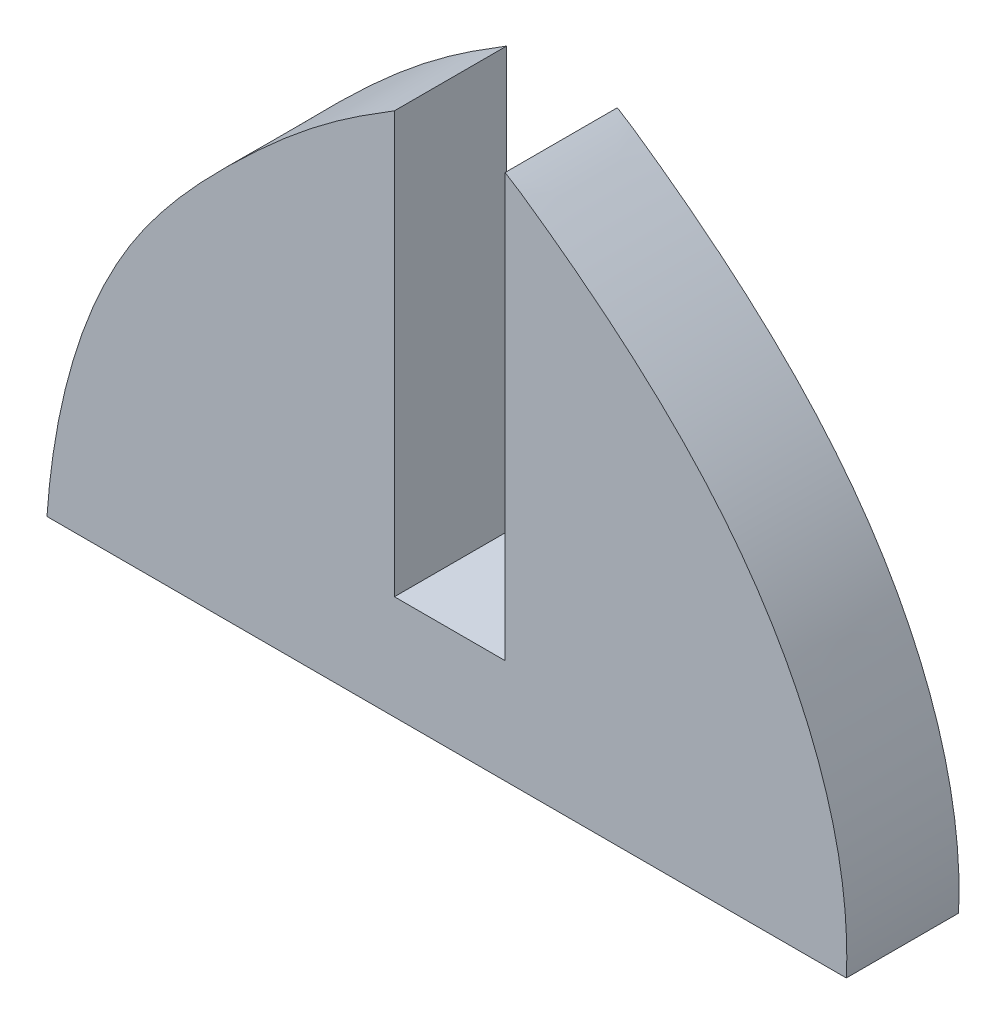
ISO-10303-21;
HEADER;
FILE_DESCRIPTION(('STEP AP214'),'2;1');
FILE_NAME('part.step','',(''),(''),'','','');
FILE_SCHEMA(('AUTOMOTIVE_DESIGN { 1 0 10303 214 1 1 1 1 }'));
ENDSEC;
DATA;
#1=APPLICATION_CONTEXT('core data for automotive mechanical design processes');
#2=APPLICATION_PROTOCOL_DEFINITION('international standard','automotive_design',2000,#1);
#3=PRODUCT_CONTEXT('',#1,'mechanical');
#4=PRODUCT('Part','Part','',(#3));
#5=PRODUCT_RELATED_PRODUCT_CATEGORY('part','',(#4));
#6=PRODUCT_DEFINITION_FORMATION('','',#4);
#7=PRODUCT_DEFINITION_CONTEXT('part definition',#1,'design');
#8=PRODUCT_DEFINITION('design','',#6,#7);
#9=PRODUCT_DEFINITION_SHAPE('','',#8);
#10=(LENGTH_UNIT() NAMED_UNIT(*) SI_UNIT(.MILLI.,.METRE.));
#11=(NAMED_UNIT(*) PLANE_ANGLE_UNIT() SI_UNIT($,.RADIAN.));
#12=(NAMED_UNIT(*) SI_UNIT($,.STERADIAN.) SOLID_ANGLE_UNIT());
#13=UNCERTAINTY_MEASURE_WITH_UNIT(LENGTH_MEASURE(1.E-05),#10,'distance_accuracy_value','');
#14=(GEOMETRIC_REPRESENTATION_CONTEXT(3) GLOBAL_UNCERTAINTY_ASSIGNED_CONTEXT((#13)) GLOBAL_UNIT_ASSIGNED_CONTEXT((#10,
#11,#12)) REPRESENTATION_CONTEXT('',''));
#15=CARTESIAN_POINT('',(0.,0.,0.));
#16=DIRECTION('',(0.,0.,1.));
#17=DIRECTION('',(1.,0.,0.));
#18=AXIS2_PLACEMENT_3D('',#15,#16,#17);
#19=CARTESIAN_POINT('',(1205.00034388867,0.,8.));
#20=DIRECTION('',(1.,0.,0.));
#21=DIRECTION('',(0.,0.,-1.));
#22=AXIS2_PLACEMENT_3D('',#19,#20,#21);
#23=PLANE('',#22);
#24=DIRECTION('',(0.,-1.,0.));
#25=VECTOR('',#24,1.);
#26=CARTESIAN_POINT('',(1205.00034388867,0.,0.));
#27=LINE('',#26,#25);
#28=CARTESIAN_POINT('',(1205.00034388867,200.380448256608,0.));
#29=VERTEX_POINT('',#28);
#30=CARTESIAN_POINT('',(1205.00034388867,170.380448256608,0.));
#31=VERTEX_POINT('',#30);
#32=EDGE_CURVE('E125',#29,#31,#27,.T.);
#33=ORIENTED_EDGE('',*,*,#32,.F.);
#34=DIRECTION('',(0.,0.,-1.));
#35=VECTOR('',#34,1.);
#36=CARTESIAN_POINT('',(1205.00034388867,200.380448256608,8.));
#37=LINE('',#36,#35);
#38=CARTESIAN_POINT('',(1205.00034388867,200.380448256608,8.));
#39=VERTEX_POINT('',#38);
#40=EDGE_CURVE('E11',#39,#29,#37,.T.);
#41=ORIENTED_EDGE('',*,*,#40,.F.);
#42=DIRECTION('',(0.,-1.,0.));
#43=VECTOR('',#42,1.);
#44=CARTESIAN_POINT('',(1205.00034388867,0.,8.));
#45=LINE('',#44,#43);
#46=CARTESIAN_POINT('',(1205.00034388867,170.380448256608,8.));
#47=VERTEX_POINT('',#46);
#48=EDGE_CURVE('E148',#39,#47,#45,.T.);
#49=ORIENTED_EDGE('',*,*,#48,.T.);
#50=DIRECTION('',(0.,0.,-1.));
#51=VECTOR('',#50,1.);
#52=CARTESIAN_POINT('',(1205.00034388867,170.380448256608,8.));
#53=LINE('',#52,#51);
#54=EDGE_CURVE('E57',#47,#31,#53,.T.);
#55=ORIENTED_EDGE('',*,*,#54,.T.);
#56=EDGE_LOOP('',(#33,#41,#49,#55));
#57=FACE_BOUND('',#56,.T.);
#58=ADVANCED_FACE('F41',(#57),#23,.T.);
#59=CARTESIAN_POINT('',(1205.00034388867,200.380448256608,8.));
#60=CARTESIAN_POINT('',(1203.80213252478,199.644141670555,8.));
#61=CARTESIAN_POINT('',(1199.65939257759,197.029571139326,8.));
#62=CARTESIAN_POINT('',(1193.27679390492,191.438907576159,8.));
#63=CARTESIAN_POINT('',(1183.52406288159,180.866285612191,8.));
#64=CARTESIAN_POINT('',(1180.69437989744,169.80625416968,8.));
#65=CARTESIAN_POINT('',(1180.23258538739,162.950604230251,8.));
#66=B_SPLINE_CURVE_WITH_KNOTS('',3,(#59,#60,#61,#62,#63,#64,#65),.UNSPECIFIED.,.F.,.F.,(4,1,1,1,
4),(0.0389514362586708,0.125740292291226,0.329523156328828,0.570718557571601,1.),.UNSPECIFIED.);
#67=DIRECTION('',(0.,0.,-1.));
#68=VECTOR('',#67,1.);
#69=SURFACE_OF_LINEAR_EXTRUSION('',#66,#68);
#70=CARTESIAN_POINT('',(1205.00034388867,200.380448256608,0.));
#71=CARTESIAN_POINT('',(1203.80213252478,199.644141670555,0.));
#72=CARTESIAN_POINT('',(1199.65939257759,197.029571139326,0.));
#73=CARTESIAN_POINT('',(1193.27679390492,191.438907576159,0.));
#74=CARTESIAN_POINT('',(1183.52406288159,180.866285612191,0.));
#75=CARTESIAN_POINT('',(1180.69437989744,169.80625416968,0.));
#76=CARTESIAN_POINT('',(1180.23258538739,162.950604230251,0.));
#77=B_SPLINE_CURVE_WITH_KNOTS('',3,(#70,#71,#72,#73,#74,#75,#76),.UNSPECIFIED.,.F.,.F.,(4,1,1,1,
4),(0.0389514362586708,0.125740292291226,0.329523156328828,0.570718557571601,1.),.UNSPECIFIED.);
#78=CARTESIAN_POINT('',(1180.23258538739,162.950604230251,0.));
#79=VERTEX_POINT('',#78);
#80=EDGE_CURVE('E127',#29,#79,#77,.T.);
#81=ORIENTED_EDGE('',*,*,#80,.T.);
#82=DIRECTION('',(0.,0.,-1.));
#83=VECTOR('',#82,1.);
#84=CARTESIAN_POINT('',(1180.23258538739,162.950604230251,8.));
#85=LINE('',#84,#83);
#86=CARTESIAN_POINT('',(1180.23258538739,162.950604230251,8.));
#87=VERTEX_POINT('',#86);
#88=EDGE_CURVE('E49',#87,#79,#85,.T.);
#89=ORIENTED_EDGE('',*,*,#88,.F.);
#90=EDGE_CURVE('E181',#39,#87,#66,.T.);
#91=ORIENTED_EDGE('',*,*,#90,.F.);
#92=ORIENTED_EDGE('',*,*,#40,.T.);
#93=EDGE_LOOP('',(#81,#89,#91,#92));
#94=FACE_BOUND('',#93,.T.);
#95=ADVANCED_FACE('F171',(#94),#69,.F.);
#96=CARTESIAN_POINT('',(0.,162.950604230251,8.));
#97=DIRECTION('',(0.,1.,0.));
#98=DIRECTION('',(0.,0.,1.));
#99=AXIS2_PLACEMENT_3D('',#96,#97,#98);
#100=PLANE('',#99);
#101=DIRECTION('',(1.,0.,0.));
#102=VECTOR('',#101,1.);
#103=CARTESIAN_POINT('',(0.,162.950604230251,0.));
#104=LINE('',#103,#102);
#105=CARTESIAN_POINT('',(1237.21188313421,162.950604230251,0.));
#106=VERTEX_POINT('',#105);
#107=EDGE_CURVE('E131',#79,#106,#104,.T.);
#108=ORIENTED_EDGE('',*,*,#107,.T.);
#109=DIRECTION('',(0.,0.,-1.));
#110=VECTOR('',#109,1.);
#111=CARTESIAN_POINT('',(1237.21188313421,162.950604230251,8.));
#112=LINE('',#111,#110);
#113=CARTESIAN_POINT('',(1237.21188313421,162.950604230251,8.));
#114=VERTEX_POINT('',#113);
#115=EDGE_CURVE('E104',#114,#106,#112,.T.);
#116=ORIENTED_EDGE('',*,*,#115,.F.);
#117=DIRECTION('',(1.,0.,0.));
#118=VECTOR('',#117,1.);
#119=CARTESIAN_POINT('',(0.,162.950604230251,8.));
#120=LINE('',#119,#118);
#121=EDGE_CURVE('E113',#87,#114,#120,.T.);
#122=ORIENTED_EDGE('',*,*,#121,.F.);
#123=ORIENTED_EDGE('',*,*,#88,.T.);
#124=EDGE_LOOP('',(#108,#116,#122,#123));
#125=FACE_BOUND('',#124,.T.);
#126=ADVANCED_FACE('F155',(#125),#100,.F.);
#127=CARTESIAN_POINT('',(1212.88866118045,200.514821587927,8.));
#128=CARTESIAN_POINT('',(1213.59179640361,200.102674546262,8.));
#129=CARTESIAN_POINT('',(1216.32224842587,198.206599205309,8.));
#130=CARTESIAN_POINT('',(1221.9149196757,193.96439188776,8.));
#131=CARTESIAN_POINT('',(1232.59596714364,183.625439508134,8.));
#132=CARTESIAN_POINT('',(1237.63796635607,171.49147838396,8.));
#133=CARTESIAN_POINT('',(1237.21188313421,162.950604230251,8.));
#134=B_SPLINE_CURVE_WITH_KNOTS('',3,(#127,#128,#129,#130,#131,#132,#133),.UNSPECIFIED.,.F.,.F.,
(4,1,1,1,4),(0.0383900692256274,0.0887637057894614,0.237953218839252,0.477618195180181,1.),.UNSPECIFIED.);
#135=DIRECTION('',(0.,0.,-1.));
#136=VECTOR('',#135,1.);
#137=SURFACE_OF_LINEAR_EXTRUSION('',#134,#136);
#138=CARTESIAN_POINT('',(1212.88866118045,200.514821587927,0.));
#139=CARTESIAN_POINT('',(1213.59179640361,200.102674546262,0.));
#140=CARTESIAN_POINT('',(1216.32224842587,198.206599205309,0.));
#141=CARTESIAN_POINT('',(1221.9149196757,193.96439188776,0.));
#142=CARTESIAN_POINT('',(1232.59596714364,183.625439508134,0.));
#143=CARTESIAN_POINT('',(1237.63796635607,171.49147838396,0.));
#144=CARTESIAN_POINT('',(1237.21188313421,162.950604230251,0.));
#145=B_SPLINE_CURVE_WITH_KNOTS('',3,(#138,#139,#140,#141,#142,#143,#144),.UNSPECIFIED.,.F.,.F.,
(4,1,1,1,4),(0.0383900692256274,0.0887637057894614,0.237953218839252,0.477618195180181,1.),.UNSPECIFIED.);
#146=CARTESIAN_POINT('',(1212.88866118045,200.514821587927,0.));
#147=VERTEX_POINT('',#146);
#148=EDGE_CURVE('E100',#147,#106,#145,.T.);
#149=ORIENTED_EDGE('',*,*,#148,.F.);
#150=DIRECTION('',(0.,0.,-1.));
#151=VECTOR('',#150,1.);
#152=CARTESIAN_POINT('',(1212.88866118045,200.514821587927,8.));
#153=LINE('',#152,#151);
#154=CARTESIAN_POINT('',(1212.88866118045,200.514821587927,8.));
#155=VERTEX_POINT('',#154);
#156=EDGE_CURVE('E95',#155,#147,#153,.T.);
#157=ORIENTED_EDGE('',*,*,#156,.F.);
#158=EDGE_CURVE('E98',#155,#114,#134,.T.);
#159=ORIENTED_EDGE('',*,*,#158,.T.);
#160=ORIENTED_EDGE('',*,*,#115,.T.);
#161=EDGE_LOOP('',(#149,#157,#159,#160));
#162=FACE_BOUND('',#161,.T.);
#163=ADVANCED_FACE('F97',(#162),#137,.T.);
#164=CARTESIAN_POINT('',(1212.88866118045,-8.9371489703409E-12,8.));
#165=DIRECTION('',(-1.,0.,0.));
#166=DIRECTION('',(0.,-1.,0.));
#167=AXIS2_PLACEMENT_3D('',#164,#165,#166);
#168=PLANE('',#167);
#169=DIRECTION('',(0.,1.,0.));
#170=VECTOR('',#169,1.);
#171=CARTESIAN_POINT('',(1212.88866118045,-8.9371489703409E-12,0.));
#172=LINE('',#171,#170);
#173=CARTESIAN_POINT('',(1212.88866118045,170.380448256608,0.));
#174=VERTEX_POINT('',#173);
#175=EDGE_CURVE('E140',#174,#147,#172,.T.);
#176=ORIENTED_EDGE('',*,*,#175,.F.);
#177=DIRECTION('',(0.,0.,-1.));
#178=VECTOR('',#177,1.);
#179=CARTESIAN_POINT('',(1212.88866118045,170.380448256608,8.));
#180=LINE('',#179,#178);
#181=CARTESIAN_POINT('',(1212.88866118045,170.380448256608,8.));
#182=VERTEX_POINT('',#181);
#183=EDGE_CURVE('E76',#182,#174,#180,.T.);
#184=ORIENTED_EDGE('',*,*,#183,.F.);
#185=DIRECTION('',(0.,1.,0.));
#186=VECTOR('',#185,1.);
#187=CARTESIAN_POINT('',(1212.88866118045,-8.9371489703409E-12,8.));
#188=LINE('',#187,#186);
#189=EDGE_CURVE('E111',#182,#155,#188,.T.);
#190=ORIENTED_EDGE('',*,*,#189,.T.);
#191=ORIENTED_EDGE('',*,*,#156,.T.);
#192=EDGE_LOOP('',(#176,#184,#190,#191));
#193=FACE_BOUND('',#192,.T.);
#194=ADVANCED_FACE('F116',(#193),#168,.T.);
#195=CARTESIAN_POINT('',(0.,170.380448256608,8.));
#196=DIRECTION('',(0.,1.,0.));
#197=DIRECTION('',(0.,0.,1.));
#198=AXIS2_PLACEMENT_3D('',#195,#196,#197);
#199=PLANE('',#198);
#200=DIRECTION('',(1.,0.,0.));
#201=VECTOR('',#200,1.);
#202=CARTESIAN_POINT('',(0.,170.380448256608,0.));
#203=LINE('',#202,#201);
#204=EDGE_CURVE('E145',#31,#174,#203,.T.);
#205=ORIENTED_EDGE('',*,*,#204,.F.);
#206=ORIENTED_EDGE('',*,*,#54,.F.);
#207=DIRECTION('',(1.,0.,0.));
#208=VECTOR('',#207,1.);
#209=CARTESIAN_POINT('',(0.,170.380448256608,8.));
#210=LINE('',#209,#208);
#211=EDGE_CURVE('E117',#47,#182,#210,.T.);
#212=ORIENTED_EDGE('',*,*,#211,.T.);
#213=ORIENTED_EDGE('',*,*,#183,.T.);
#214=EDGE_LOOP('',(#205,#206,#212,#213));
#215=FACE_BOUND('',#214,.T.);
#216=ADVANCED_FACE('F160',(#215),#199,.T.);
#217=CARTESIAN_POINT('',(0.,0.,8.));
#218=DIRECTION('',(0.,0.,1.));
#219=DIRECTION('',(1.,0.,0.));
#220=AXIS2_PLACEMENT_3D('',#217,#218,#219);
#221=PLANE('',#220);
#222=ORIENTED_EDGE('',*,*,#48,.F.);
#223=ORIENTED_EDGE('',*,*,#90,.T.);
#224=ORIENTED_EDGE('',*,*,#121,.T.);
#225=ORIENTED_EDGE('',*,*,#158,.F.);
#226=ORIENTED_EDGE('',*,*,#189,.F.);
#227=ORIENTED_EDGE('',*,*,#211,.F.);
#228=EDGE_LOOP('',(#222,#223,#224,#225,#226,#227));
#229=FACE_BOUND('',#228,.T.);
#230=ADVANCED_FACE('F109',(#229),#221,.T.);
#231=CARTESIAN_POINT('',(0.,0.,0.));
#232=DIRECTION('',(0.,0.,1.));
#233=DIRECTION('',(1.,0.,0.));
#234=AXIS2_PLACEMENT_3D('',#231,#232,#233);
#235=PLANE('',#234);
#236=ORIENTED_EDGE('',*,*,#32,.T.);
#237=ORIENTED_EDGE('',*,*,#204,.T.);
#238=ORIENTED_EDGE('',*,*,#175,.T.);
#239=ORIENTED_EDGE('',*,*,#148,.T.);
#240=ORIENTED_EDGE('',*,*,#107,.F.);
#241=ORIENTED_EDGE('',*,*,#80,.F.);
#242=EDGE_LOOP('',(#236,#237,#238,#239,#240,#241));
#243=FACE_BOUND('',#242,.T.);
#244=ADVANCED_FACE('F159',(#243),#235,.F.);
#245=CLOSED_SHELL('',(#58,#95,#126,#163,#194,#216,#230,#244));
#246=MANIFOLD_SOLID_BREP('B2',#245);
#247=ADVANCED_BREP_SHAPE_REPRESENTATION('',(#18,#246),#14);
#248=SHAPE_DEFINITION_REPRESENTATION(#9,#247);
ENDSEC;
END-ISO-10303-21;
